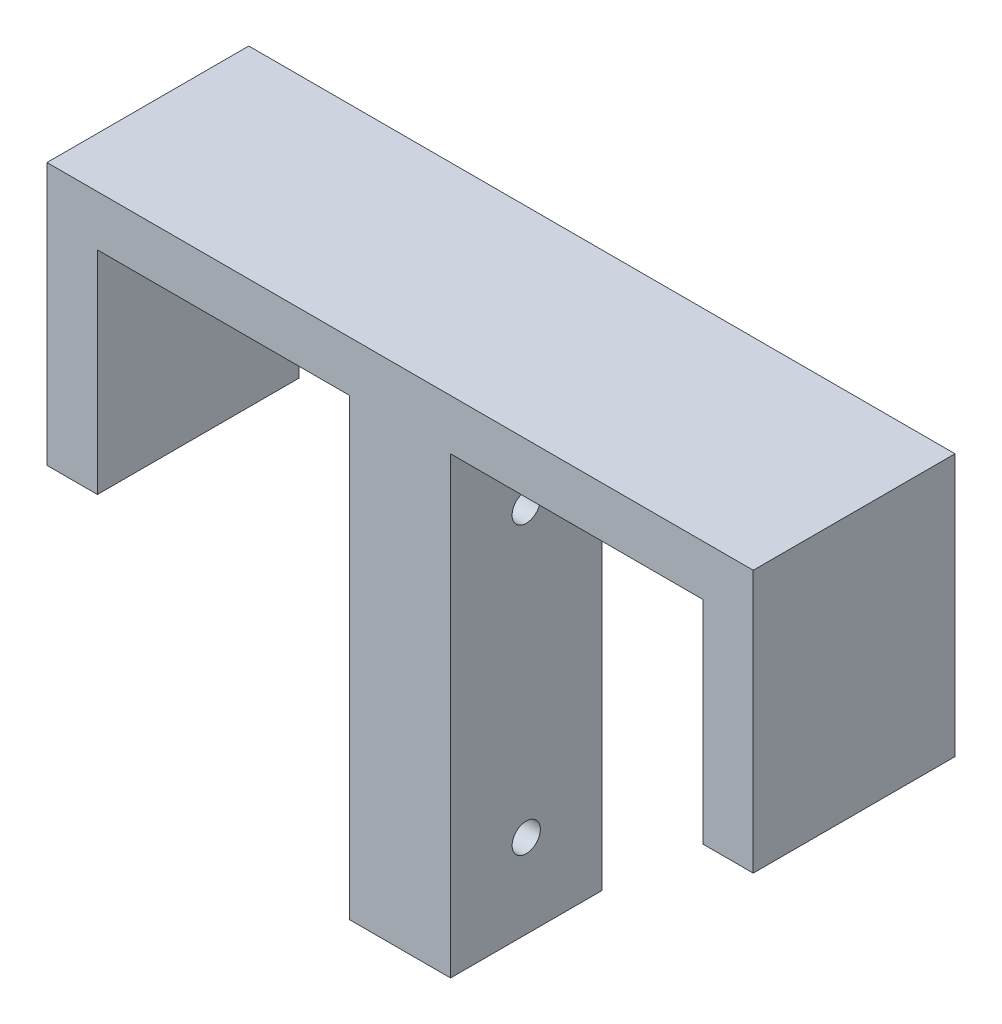
ISO-10303-21;
HEADER;
FILE_DESCRIPTION(('STEP AP214'),'2;1');
FILE_NAME('part.step','',(''),(''),'','','');
FILE_SCHEMA(('AUTOMOTIVE_DESIGN { 1 0 10303 214 1 1 1 1 }'));
ENDSEC;
DATA;
#1=APPLICATION_CONTEXT('core data for automotive mechanical design processes');
#2=APPLICATION_PROTOCOL_DEFINITION('international standard','automotive_design',2000,#1);
#3=PRODUCT_CONTEXT('',#1,'mechanical');
#4=PRODUCT('Part','Part','',(#3));
#5=PRODUCT_RELATED_PRODUCT_CATEGORY('part','',(#4));
#6=PRODUCT_DEFINITION_FORMATION('','',#4);
#7=PRODUCT_DEFINITION_CONTEXT('part definition',#1,'design');
#8=PRODUCT_DEFINITION('design','',#6,#7);
#9=PRODUCT_DEFINITION_SHAPE('','',#8);
#10=(LENGTH_UNIT() NAMED_UNIT(*) SI_UNIT(.MILLI.,.METRE.));
#11=(NAMED_UNIT(*) PLANE_ANGLE_UNIT() SI_UNIT($,.RADIAN.));
#12=(NAMED_UNIT(*) SI_UNIT($,.STERADIAN.) SOLID_ANGLE_UNIT());
#13=UNCERTAINTY_MEASURE_WITH_UNIT(LENGTH_MEASURE(1.E-05),#10,'distance_accuracy_value','');
#14=(GEOMETRIC_REPRESENTATION_CONTEXT(3) GLOBAL_UNCERTAINTY_ASSIGNED_CONTEXT((#13)) GLOBAL_UNIT_ASSIGNED_CONTEXT((#10,
#11,#12)) REPRESENTATION_CONTEXT('',''));
#15=CARTESIAN_POINT('',(0.,0.,0.));
#16=DIRECTION('',(0.,0.,1.));
#17=DIRECTION('',(1.,0.,0.));
#18=AXIS2_PLACEMENT_3D('',#15,#16,#17);
#19=CARTESIAN_POINT('',(3.175,-14.2875,9.525));
#20=DIRECTION('',(-1.,0.,0.));
#21=DIRECTION('',(0.,0.,1.));
#22=AXIS2_PLACEMENT_3D('',#19,#20,#21);
#23=PLANE('',#22);
#24=CARTESIAN_POINT('',(3.175,-9.0043,4.7625));
#25=DIRECTION('',(1.,0.,0.));
#26=DIRECTION('',(0.,0.,-1.));
#27=AXIS2_PLACEMENT_3D('',#24,#25,#26);
#28=CIRCLE('',#27,0.889);
#29=CARTESIAN_POINT('',(3.175,-9.0043,3.8735));
#30=VERTEX_POINT('',#29);
#31=EDGE_CURVE('E246',#30,#30,#28,.T.);
#32=ORIENTED_EDGE('',*,*,#31,.F.);
#33=EDGE_LOOP('',(#32));
#34=FACE_BOUND('',#33,.T.);
#35=CARTESIAN_POINT('',(3.175,9.0043,4.7625));
#36=DIRECTION('',(1.,0.,0.));
#37=DIRECTION('',(0.,0.,1.));
#38=AXIS2_PLACEMENT_3D('',#35,#36,#37);
#39=CIRCLE('',#38,0.889);
#40=CARTESIAN_POINT('',(3.175,9.0043,5.6515));
#41=VERTEX_POINT('',#40);
#42=EDGE_CURVE('E249',#41,#41,#39,.T.);
#43=ORIENTED_EDGE('',*,*,#42,.F.);
#44=EDGE_LOOP('',(#43));
#45=FACE_BOUND('',#44,.T.);
#46=DIRECTION('',(0.,1.,0.));
#47=VECTOR('',#46,1.);
#48=CARTESIAN_POINT('',(3.175,-14.2875,0.));
#49=LINE('',#48,#47);
#50=CARTESIAN_POINT('',(3.175,-14.2875,0.));
#51=VERTEX_POINT('',#50);
#52=CARTESIAN_POINT('',(3.175,14.2875,0.));
#53=VERTEX_POINT('',#52);
#54=EDGE_CURVE('E194',#51,#53,#49,.T.);
#55=ORIENTED_EDGE('',*,*,#54,.T.);
#56=DIRECTION('',(0.,0.,-1.));
#57=VECTOR('',#56,1.);
#58=CARTESIAN_POINT('',(3.175,14.2875,9.525));
#59=LINE('',#58,#57);
#60=CARTESIAN_POINT('',(3.175,14.2875,9.525));
#61=VERTEX_POINT('',#60);
#62=EDGE_CURVE('E11',#61,#53,#59,.T.);
#63=ORIENTED_EDGE('',*,*,#62,.F.);
#64=DIRECTION('',(0.,1.,0.));
#65=VECTOR('',#64,1.);
#66=CARTESIAN_POINT('',(3.175,-14.2875,9.525));
#67=LINE('',#66,#65);
#68=CARTESIAN_POINT('',(3.175,-14.2875,9.525));
#69=VERTEX_POINT('',#68);
#70=EDGE_CURVE('E77',#69,#61,#67,.T.);
#71=ORIENTED_EDGE('',*,*,#70,.F.);
#72=DIRECTION('',(0.,0.,-1.));
#73=VECTOR('',#72,1.);
#74=CARTESIAN_POINT('',(3.175,-14.2875,9.525));
#75=LINE('',#74,#73);
#76=EDGE_CURVE('E212',#69,#51,#75,.T.);
#77=ORIENTED_EDGE('',*,*,#76,.T.);
#78=EDGE_LOOP('',(#55,#63,#71,#77));
#79=FACE_BOUND('',#78,.T.);
#80=ADVANCED_FACE('F35',(#34,#45,#79),#23,.F.);
#81=CARTESIAN_POINT('',(-3.175,-14.2875,9.525));
#82=DIRECTION('',(1.,0.,0.));
#83=DIRECTION('',(0.,0.,-1.));
#84=AXIS2_PLACEMENT_3D('',#81,#82,#83);
#85=PLANE('',#84);
#86=CARTESIAN_POINT('',(-3.175,-9.0043,4.7625));
#87=DIRECTION('',(1.,0.,0.));
#88=DIRECTION('',(0.,0.,-1.));
#89=AXIS2_PLACEMENT_3D('',#86,#87,#88);
#90=CIRCLE('',#89,0.889);
#91=CARTESIAN_POINT('',(-3.175,-9.0043,3.8735));
#92=VERTEX_POINT('',#91);
#93=EDGE_CURVE('E176',#92,#92,#90,.F.);
#94=ORIENTED_EDGE('',*,*,#93,.F.);
#95=EDGE_LOOP('',(#94));
#96=FACE_BOUND('',#95,.T.);
#97=CARTESIAN_POINT('',(-3.175,9.0043,4.7625));
#98=DIRECTION('',(1.,0.,0.));
#99=DIRECTION('',(0.,0.,-1.));
#100=AXIS2_PLACEMENT_3D('',#97,#98,#99);
#101=CIRCLE('',#100,0.889);
#102=CARTESIAN_POINT('',(-3.175,9.0043,3.8735));
#103=VERTEX_POINT('',#102);
#104=EDGE_CURVE('E251',#103,#103,#101,.F.);
#105=ORIENTED_EDGE('',*,*,#104,.F.);
#106=EDGE_LOOP('',(#105));
#107=FACE_BOUND('',#106,.T.);
#108=DIRECTION('',(0.,-1.,0.));
#109=VECTOR('',#108,1.);
#110=CARTESIAN_POINT('',(-3.175,-14.2875,0.));
#111=LINE('',#110,#109);
#112=CARTESIAN_POINT('',(-3.175,14.2875,0.));
#113=VERTEX_POINT('',#112);
#114=CARTESIAN_POINT('',(-3.175,-14.2875,0.));
#115=VERTEX_POINT('',#114);
#116=EDGE_CURVE('E66',#113,#115,#111,.T.);
#117=ORIENTED_EDGE('',*,*,#116,.T.);
#118=DIRECTION('',(0.,0.,-1.));
#119=VECTOR('',#118,1.);
#120=CARTESIAN_POINT('',(-3.175,-14.2875,9.525));
#121=LINE('',#120,#119);
#122=CARTESIAN_POINT('',(-3.175,-14.2875,9.525));
#123=VERTEX_POINT('',#122);
#124=EDGE_CURVE('E221',#123,#115,#121,.T.);
#125=ORIENTED_EDGE('',*,*,#124,.F.);
#126=DIRECTION('',(0.,-1.,0.));
#127=VECTOR('',#126,1.);
#128=CARTESIAN_POINT('',(-3.175,-14.2875,9.525));
#129=LINE('',#128,#127);
#130=CARTESIAN_POINT('',(-3.175,14.2875,9.525));
#131=VERTEX_POINT('',#130);
#132=EDGE_CURVE('E209',#131,#123,#129,.T.);
#133=ORIENTED_EDGE('',*,*,#132,.F.);
#134=DIRECTION('',(0.,0.,-1.));
#135=VECTOR('',#134,1.);
#136=CARTESIAN_POINT('',(-3.175,14.2875,9.525));
#137=LINE('',#136,#135);
#138=EDGE_CURVE('E43',#131,#113,#137,.T.);
#139=ORIENTED_EDGE('',*,*,#138,.T.);
#140=EDGE_LOOP('',(#117,#125,#133,#139));
#141=FACE_BOUND('',#140,.T.);
#142=ADVANCED_FACE('F222',(#96,#107,#141),#85,.F.);
#143=CARTESIAN_POINT('',(-3.175,-14.2875,9.525));
#144=DIRECTION('',(0.,1.,0.));
#145=DIRECTION('',(0.,0.,1.));
#146=AXIS2_PLACEMENT_3D('',#143,#144,#145);
#147=PLANE('',#146);
#148=DIRECTION('',(1.,0.,0.));
#149=VECTOR('',#148,1.);
#150=CARTESIAN_POINT('',(-3.175,-14.2875,0.));
#151=LINE('',#150,#149);
#152=EDGE_CURVE('E72',#115,#51,#151,.T.);
#153=ORIENTED_EDGE('',*,*,#152,.T.);
#154=ORIENTED_EDGE('',*,*,#76,.F.);
#155=DIRECTION('',(1.,0.,0.));
#156=VECTOR('',#155,1.);
#157=CARTESIAN_POINT('',(-3.175,-14.2875,9.525));
#158=LINE('',#157,#156);
#159=EDGE_CURVE('E51',#123,#69,#158,.T.);
#160=ORIENTED_EDGE('',*,*,#159,.F.);
#161=ORIENTED_EDGE('',*,*,#124,.T.);
#162=EDGE_LOOP('',(#153,#154,#160,#161));
#163=FACE_BOUND('',#162,.T.);
#164=ADVANCED_FACE('F228',(#163),#147,.F.);
#165=CARTESIAN_POINT('',(0.,0.,9.525));
#166=DIRECTION('',(0.,0.,-1.));
#167=DIRECTION('',(-1.,0.,0.));
#168=AXIS2_PLACEMENT_3D('',#165,#166,#167);
#169=PLANE('',#168);
#170=ORIENTED_EDGE('',*,*,#70,.T.);
#171=DIRECTION('',(1.,0.,0.));
#172=VECTOR('',#171,1.);
#173=CARTESIAN_POINT('',(0.,14.2875,9.525));
#174=LINE('',#173,#172);
#175=CARTESIAN_POINT('',(19.05,14.2875,9.525));
#176=VERTEX_POINT('',#175);
#177=EDGE_CURVE('E175',#61,#176,#174,.T.);
#178=ORIENTED_EDGE('',*,*,#177,.T.);
#179=DIRECTION('',(0.,-1.,0.));
#180=VECTOR('',#179,1.);
#181=CARTESIAN_POINT('',(19.05,0.,9.525));
#182=LINE('',#181,#180);
#183=CARTESIAN_POINT('',(19.05,0.952500000000001,9.525));
#184=VERTEX_POINT('',#183);
#185=EDGE_CURVE('E178',#176,#184,#182,.T.);
#186=ORIENTED_EDGE('',*,*,#185,.T.);
#187=DIRECTION('',(-1.,0.,0.));
#188=VECTOR('',#187,1.);
#189=CARTESIAN_POINT('',(0.,0.952499999999997,9.525));
#190=LINE('',#189,#188);
#191=CARTESIAN_POINT('',(22.225,0.952500000000002,9.525));
#192=VERTEX_POINT('',#191);
#193=EDGE_CURVE('E181',#192,#184,#190,.T.);
#194=ORIENTED_EDGE('',*,*,#193,.F.);
#195=DIRECTION('',(0.,-1.,0.));
#196=VECTOR('',#195,1.);
#197=CARTESIAN_POINT('',(22.225,0.,9.525));
#198=LINE('',#197,#196);
#199=CARTESIAN_POINT('',(22.225,17.4625,9.525));
#200=VERTEX_POINT('',#199);
#201=EDGE_CURVE('E184',#200,#192,#198,.T.);
#202=ORIENTED_EDGE('',*,*,#201,.F.);
#203=DIRECTION('',(1.,0.,0.));
#204=VECTOR('',#203,1.);
#205=CARTESIAN_POINT('',(0.,17.4625,9.525));
#206=LINE('',#205,#204);
#207=CARTESIAN_POINT('',(-22.225,17.4625,9.525));
#208=VERTEX_POINT('',#207);
#209=EDGE_CURVE('E186',#208,#200,#206,.T.);
#210=ORIENTED_EDGE('',*,*,#209,.F.);
#211=DIRECTION('',(0.,-1.,0.));
#212=VECTOR('',#211,1.);
#213=CARTESIAN_POINT('',(-22.225,0.,9.525));
#214=LINE('',#213,#212);
#215=CARTESIAN_POINT('',(-22.225,0.952499999999997,9.525));
#216=VERTEX_POINT('',#215);
#217=EDGE_CURVE('E188',#208,#216,#214,.T.);
#218=ORIENTED_EDGE('',*,*,#217,.T.);
#219=DIRECTION('',(1.,0.,0.));
#220=VECTOR('',#219,1.);
#221=CARTESIAN_POINT('',(0.,0.952499999999997,9.525));
#222=LINE('',#221,#220);
#223=CARTESIAN_POINT('',(-19.05,0.952499999999997,9.525));
#224=VERTEX_POINT('',#223);
#225=EDGE_CURVE('E153',#216,#224,#222,.T.);
#226=ORIENTED_EDGE('',*,*,#225,.T.);
#227=DIRECTION('',(0.,-1.,0.));
#228=VECTOR('',#227,1.);
#229=CARTESIAN_POINT('',(-19.05,0.,9.525));
#230=LINE('',#229,#228);
#231=CARTESIAN_POINT('',(-19.05,14.2875,9.525));
#232=VERTEX_POINT('',#231);
#233=EDGE_CURVE('E173',#232,#224,#230,.T.);
#234=ORIENTED_EDGE('',*,*,#233,.F.);
#235=EDGE_CURVE('E139',#232,#131,#174,.T.);
#236=ORIENTED_EDGE('',*,*,#235,.T.);
#237=ORIENTED_EDGE('',*,*,#132,.T.);
#238=ORIENTED_EDGE('',*,*,#159,.T.);
#239=EDGE_LOOP('',(#170,#178,#186,#194,#202,#210,#218,#226,#234,#236,#237,#238));
#240=FACE_BOUND('',#239,.T.);
#241=ADVANCED_FACE('F230',(#240),#169,.F.);
#242=CARTESIAN_POINT('',(0.,0.,0.));
#243=DIRECTION('',(0.,0.,-1.));
#244=DIRECTION('',(-1.,0.,0.));
#245=AXIS2_PLACEMENT_3D('',#242,#243,#244);
#246=PLANE('',#245);
#247=ORIENTED_EDGE('',*,*,#54,.F.);
#248=ORIENTED_EDGE('',*,*,#152,.F.);
#249=ORIENTED_EDGE('',*,*,#116,.F.);
#250=DIRECTION('',(-1.,0.,0.));
#251=VECTOR('',#250,1.);
#252=CARTESIAN_POINT('',(-3.175,14.2875,0.));
#253=LINE('',#252,#251);
#254=EDGE_CURVE('E215',#53,#113,#253,.T.);
#255=ORIENTED_EDGE('',*,*,#254,.F.);
#256=EDGE_LOOP('',(#247,#248,#249,#255));
#257=FACE_BOUND('',#256,.T.);
#258=ADVANCED_FACE('F226',(#257),#246,.T.);
#259=CARTESIAN_POINT('',(0.,14.2875,-3.175));
#260=DIRECTION('',(0.,-1.,0.));
#261=DIRECTION('',(1.,0.,0.));
#262=AXIS2_PLACEMENT_3D('',#259,#260,#261);
#263=PLANE('',#262);
#264=ORIENTED_EDGE('',*,*,#62,.T.);
#265=ORIENTED_EDGE('',*,*,#254,.T.);
#266=ORIENTED_EDGE('',*,*,#138,.F.);
#267=ORIENTED_EDGE('',*,*,#235,.F.);
#268=DIRECTION('',(0.,0.,1.));
#269=VECTOR('',#268,1.);
#270=CARTESIAN_POINT('',(-19.05,14.2875,-3.175));
#271=LINE('',#270,#269);
#272=CARTESIAN_POINT('',(-19.05,14.2875,-3.175));
#273=VERTEX_POINT('',#272);
#274=EDGE_CURVE('E131',#273,#232,#271,.T.);
#275=ORIENTED_EDGE('',*,*,#274,.F.);
#276=DIRECTION('',(1.,0.,0.));
#277=VECTOR('',#276,1.);
#278=CARTESIAN_POINT('',(0.,14.2875,-3.175));
#279=LINE('',#278,#277);
#280=CARTESIAN_POINT('',(19.05,14.2875,-3.175));
#281=VERTEX_POINT('',#280);
#282=EDGE_CURVE('E136',#273,#281,#279,.T.);
#283=ORIENTED_EDGE('',*,*,#282,.T.);
#284=DIRECTION('',(0.,0.,1.));
#285=VECTOR('',#284,1.);
#286=CARTESIAN_POINT('',(19.05,14.2875,-3.175));
#287=LINE('',#286,#285);
#288=EDGE_CURVE('E143',#281,#176,#287,.T.);
#289=ORIENTED_EDGE('',*,*,#288,.T.);
#290=ORIENTED_EDGE('',*,*,#177,.F.);
#291=EDGE_LOOP('',(#264,#265,#266,#267,#275,#283,#289,#290));
#292=FACE_BOUND('',#291,.T.);
#293=ADVANCED_FACE('F133',(#292),#263,.T.);
#294=CARTESIAN_POINT('',(-19.05,0.,-3.175));
#295=DIRECTION('',(-1.,0.,0.));
#296=DIRECTION('',(0.,0.,1.));
#297=AXIS2_PLACEMENT_3D('',#294,#295,#296);
#298=PLANE('',#297);
#299=ORIENTED_EDGE('',*,*,#233,.T.);
#300=DIRECTION('',(0.,0.,1.));
#301=VECTOR('',#300,1.);
#302=CARTESIAN_POINT('',(-19.05,0.952499999999997,-3.175));
#303=LINE('',#302,#301);
#304=CARTESIAN_POINT('',(-19.05,0.952499999999997,-3.175));
#305=VERTEX_POINT('',#304);
#306=EDGE_CURVE('E149',#305,#224,#303,.T.);
#307=ORIENTED_EDGE('',*,*,#306,.F.);
#308=DIRECTION('',(0.,-1.,0.));
#309=VECTOR('',#308,1.);
#310=CARTESIAN_POINT('',(-19.05,0.,-3.175));
#311=LINE('',#310,#309);
#312=EDGE_CURVE('E147',#273,#305,#311,.T.);
#313=ORIENTED_EDGE('',*,*,#312,.F.);
#314=ORIENTED_EDGE('',*,*,#274,.T.);
#315=EDGE_LOOP('',(#299,#307,#313,#314));
#316=FACE_BOUND('',#315,.T.);
#317=ADVANCED_FACE('F148',(#316),#298,.F.);
#318=CARTESIAN_POINT('',(0.,0.952499999999997,-3.175));
#319=DIRECTION('',(0.,-1.,0.));
#320=DIRECTION('',(0.,0.,-1.));
#321=AXIS2_PLACEMENT_3D('',#318,#319,#320);
#322=PLANE('',#321);
#323=ORIENTED_EDGE('',*,*,#225,.F.);
#324=DIRECTION('',(0.,0.,1.));
#325=VECTOR('',#324,1.);
#326=CARTESIAN_POINT('',(-22.225,0.952499999999997,-3.175));
#327=LINE('',#326,#325);
#328=CARTESIAN_POINT('',(-22.225,0.952499999999997,-3.175));
#329=VERTEX_POINT('',#328);
#330=EDGE_CURVE('E195',#329,#216,#327,.T.);
#331=ORIENTED_EDGE('',*,*,#330,.F.);
#332=DIRECTION('',(1.,0.,0.));
#333=VECTOR('',#332,1.);
#334=CARTESIAN_POINT('',(0.,0.952499999999997,-3.175));
#335=LINE('',#334,#333);
#336=EDGE_CURVE('E144',#329,#305,#335,.T.);
#337=ORIENTED_EDGE('',*,*,#336,.T.);
#338=ORIENTED_EDGE('',*,*,#306,.T.);
#339=EDGE_LOOP('',(#323,#331,#337,#338));
#340=FACE_BOUND('',#339,.T.);
#341=ADVANCED_FACE('F275',(#340),#322,.T.);
#342=CARTESIAN_POINT('',(-22.225,0.,-3.175));
#343=DIRECTION('',(-1.,0.,0.));
#344=DIRECTION('',(0.,-1.,0.));
#345=AXIS2_PLACEMENT_3D('',#342,#343,#344);
#346=PLANE('',#345);
#347=ORIENTED_EDGE('',*,*,#217,.F.);
#348=DIRECTION('',(0.,0.,1.));
#349=VECTOR('',#348,1.);
#350=CARTESIAN_POINT('',(-22.225,17.4625,-3.175));
#351=LINE('',#350,#349);
#352=CARTESIAN_POINT('',(-22.225,17.4625,-3.175));
#353=VERTEX_POINT('',#352);
#354=EDGE_CURVE('E197',#353,#208,#351,.T.);
#355=ORIENTED_EDGE('',*,*,#354,.F.);
#356=DIRECTION('',(0.,-1.,0.));
#357=VECTOR('',#356,1.);
#358=CARTESIAN_POINT('',(-22.225,0.,-3.175));
#359=LINE('',#358,#357);
#360=EDGE_CURVE('E169',#353,#329,#359,.T.);
#361=ORIENTED_EDGE('',*,*,#360,.T.);
#362=ORIENTED_EDGE('',*,*,#330,.T.);
#363=EDGE_LOOP('',(#347,#355,#361,#362));
#364=FACE_BOUND('',#363,.T.);
#365=ADVANCED_FACE('F278',(#364),#346,.T.);
#366=CARTESIAN_POINT('',(0.,17.4625,-3.175));
#367=DIRECTION('',(0.,-1.,0.));
#368=DIRECTION('',(0.,0.,-1.));
#369=AXIS2_PLACEMENT_3D('',#366,#367,#368);
#370=PLANE('',#369);
#371=ORIENTED_EDGE('',*,*,#209,.T.);
#372=DIRECTION('',(0.,0.,1.));
#373=VECTOR('',#372,1.);
#374=CARTESIAN_POINT('',(22.225,17.4625,-3.175));
#375=LINE('',#374,#373);
#376=CARTESIAN_POINT('',(22.225,17.4625,-3.175));
#377=VERTEX_POINT('',#376);
#378=EDGE_CURVE('E199',#377,#200,#375,.T.);
#379=ORIENTED_EDGE('',*,*,#378,.F.);
#380=DIRECTION('',(1.,0.,0.));
#381=VECTOR('',#380,1.);
#382=CARTESIAN_POINT('',(0.,17.4625,-3.175));
#383=LINE('',#382,#381);
#384=EDGE_CURVE('E167',#353,#377,#383,.T.);
#385=ORIENTED_EDGE('',*,*,#384,.F.);
#386=ORIENTED_EDGE('',*,*,#354,.T.);
#387=EDGE_LOOP('',(#371,#379,#385,#386));
#388=FACE_BOUND('',#387,.T.);
#389=ADVANCED_FACE('F282',(#388),#370,.F.);
#390=CARTESIAN_POINT('',(22.225,0.,-3.175));
#391=DIRECTION('',(-1.,0.,0.));
#392=DIRECTION('',(0.,-1.,0.));
#393=AXIS2_PLACEMENT_3D('',#390,#391,#392);
#394=PLANE('',#393);
#395=ORIENTED_EDGE('',*,*,#201,.T.);
#396=DIRECTION('',(0.,0.,1.));
#397=VECTOR('',#396,1.);
#398=CARTESIAN_POINT('',(22.225,0.952500000000002,-3.175));
#399=LINE('',#398,#397);
#400=CARTESIAN_POINT('',(22.225,0.952500000000002,-3.175));
#401=VERTEX_POINT('',#400);
#402=EDGE_CURVE('E202',#401,#192,#399,.T.);
#403=ORIENTED_EDGE('',*,*,#402,.F.);
#404=DIRECTION('',(0.,-1.,0.));
#405=VECTOR('',#404,1.);
#406=CARTESIAN_POINT('',(22.225,0.,-3.175));
#407=LINE('',#406,#405);
#408=EDGE_CURVE('E165',#377,#401,#407,.T.);
#409=ORIENTED_EDGE('',*,*,#408,.F.);
#410=ORIENTED_EDGE('',*,*,#378,.T.);
#411=EDGE_LOOP('',(#395,#403,#409,#410));
#412=FACE_BOUND('',#411,.T.);
#413=ADVANCED_FACE('F286',(#412),#394,.F.);
#414=CARTESIAN_POINT('',(0.,0.952499999999997,-3.175));
#415=DIRECTION('',(0.,1.,0.));
#416=DIRECTION('',(-1.,0.,0.));
#417=AXIS2_PLACEMENT_3D('',#414,#415,#416);
#418=PLANE('',#417);
#419=ORIENTED_EDGE('',*,*,#193,.T.);
#420=DIRECTION('',(0.,0.,1.));
#421=VECTOR('',#420,1.);
#422=CARTESIAN_POINT('',(19.05,0.952500000000001,-3.175));
#423=LINE('',#422,#421);
#424=CARTESIAN_POINT('',(19.05,0.952500000000001,-3.175));
#425=VERTEX_POINT('',#424);
#426=EDGE_CURVE('E205',#425,#184,#423,.T.);
#427=ORIENTED_EDGE('',*,*,#426,.F.);
#428=DIRECTION('',(-1.,0.,0.));
#429=VECTOR('',#428,1.);
#430=CARTESIAN_POINT('',(0.,0.952499999999997,-3.175));
#431=LINE('',#430,#429);
#432=EDGE_CURVE('E160',#401,#425,#431,.T.);
#433=ORIENTED_EDGE('',*,*,#432,.F.);
#434=ORIENTED_EDGE('',*,*,#402,.T.);
#435=EDGE_LOOP('',(#419,#427,#433,#434));
#436=FACE_BOUND('',#435,.T.);
#437=ADVANCED_FACE('F290',(#436),#418,.F.);
#438=CARTESIAN_POINT('',(19.05,0.,-3.175));
#439=DIRECTION('',(-1.,0.,0.));
#440=DIRECTION('',(0.,-1.,0.));
#441=AXIS2_PLACEMENT_3D('',#438,#439,#440);
#442=PLANE('',#441);
#443=ORIENTED_EDGE('',*,*,#185,.F.);
#444=ORIENTED_EDGE('',*,*,#288,.F.);
#445=DIRECTION('',(0.,-1.,0.));
#446=VECTOR('',#445,1.);
#447=CARTESIAN_POINT('',(19.05,0.,-3.175));
#448=LINE('',#447,#446);
#449=EDGE_CURVE('E158',#281,#425,#448,.T.);
#450=ORIENTED_EDGE('',*,*,#449,.T.);
#451=ORIENTED_EDGE('',*,*,#426,.T.);
#452=EDGE_LOOP('',(#443,#444,#450,#451));
#453=FACE_BOUND('',#452,.T.);
#454=ADVANCED_FACE('F272',(#453),#442,.T.);
#455=CARTESIAN_POINT('',(0.,0.,-3.175));
#456=DIRECTION('',(0.,0.,1.));
#457=DIRECTION('',(1.,0.,0.));
#458=AXIS2_PLACEMENT_3D('',#455,#456,#457);
#459=PLANE('',#458);
#460=ORIENTED_EDGE('',*,*,#312,.T.);
#461=ORIENTED_EDGE('',*,*,#336,.F.);
#462=ORIENTED_EDGE('',*,*,#360,.F.);
#463=ORIENTED_EDGE('',*,*,#384,.T.);
#464=ORIENTED_EDGE('',*,*,#408,.T.);
#465=ORIENTED_EDGE('',*,*,#432,.T.);
#466=ORIENTED_EDGE('',*,*,#449,.F.);
#467=ORIENTED_EDGE('',*,*,#282,.F.);
#468=EDGE_LOOP('',(#460,#461,#462,#463,#464,#465,#466,#467));
#469=FACE_BOUND('',#468,.T.);
#470=ADVANCED_FACE('F156',(#469),#459,.F.);
#471=CARTESIAN_POINT('',(-22.226,9.0043,4.7625));
#472=DIRECTION('',(1.,0.,0.));
#473=DIRECTION('',(0.,0.,-1.));
#474=AXIS2_PLACEMENT_3D('',#471,#472,#473);
#475=CYLINDRICAL_SURFACE('',#474,0.889);
#476=ORIENTED_EDGE('',*,*,#42,.T.);
#477=EDGE_LOOP('',(#476));
#478=FACE_BOUND('',#477,.T.);
#479=ORIENTED_EDGE('',*,*,#104,.T.);
#480=EDGE_LOOP('',(#479));
#481=FACE_BOUND('',#480,.T.);
#482=ADVANCED_FACE('F261',(#478,#481),#475,.F.);
#483=CARTESIAN_POINT('',(-22.226,-9.0043,4.7625));
#484=DIRECTION('',(1.,0.,0.));
#485=DIRECTION('',(0.,0.,-1.));
#486=AXIS2_PLACEMENT_3D('',#483,#484,#485);
#487=CYLINDRICAL_SURFACE('',#486,0.889);
#488=ORIENTED_EDGE('',*,*,#31,.T.);
#489=EDGE_LOOP('',(#488));
#490=FACE_BOUND('',#489,.T.);
#491=ORIENTED_EDGE('',*,*,#93,.T.);
#492=EDGE_LOOP('',(#491));
#493=FACE_BOUND('',#492,.T.);
#494=ADVANCED_FACE('F258',(#490,#493),#487,.F.);
#495=CLOSED_SHELL('',(#80,#142,#164,#241,#258,#293,#317,#341,#365,#389,#413,#437,#454,#470,#482,#494));
#496=MANIFOLD_SOLID_BREP('B2',#495);
#497=ADVANCED_BREP_SHAPE_REPRESENTATION('',(#18,#496),#14);
#498=SHAPE_DEFINITION_REPRESENTATION(#9,#497);
ENDSEC;
END-ISO-10303-21;
